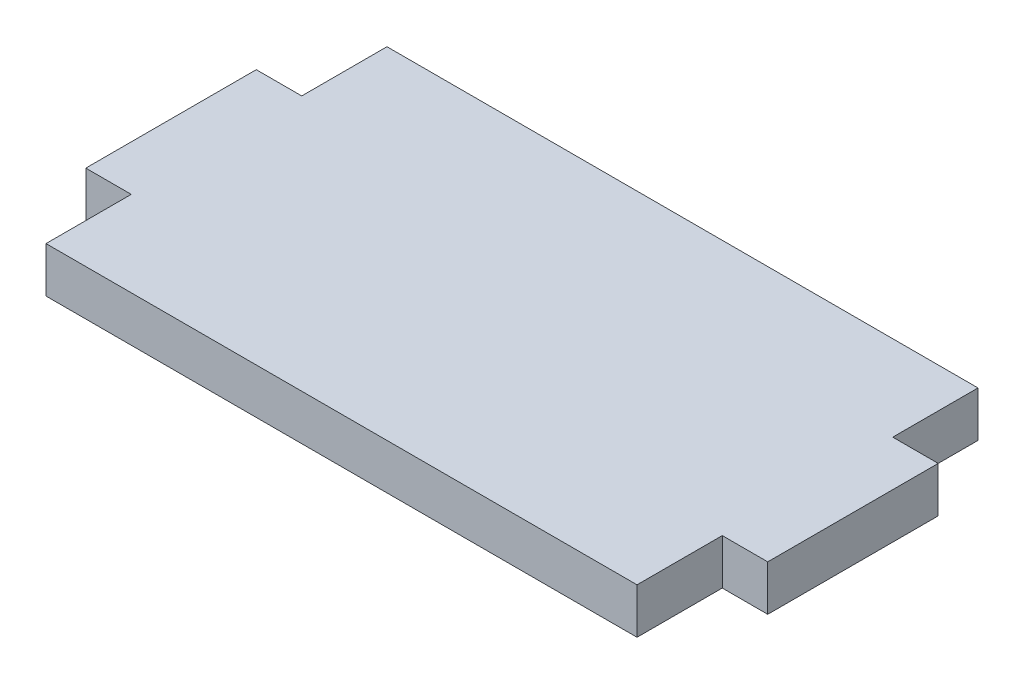
ISO-10303-21;
HEADER;
FILE_DESCRIPTION(('STEP AP214'),'2;1');
FILE_NAME('part.step','',(''),(''),'','','');
FILE_SCHEMA(('AUTOMOTIVE_DESIGN { 1 0 10303 214 1 1 1 1 }'));
ENDSEC;
DATA;
#1=APPLICATION_CONTEXT('core data for automotive mechanical design processes');
#2=APPLICATION_PROTOCOL_DEFINITION('international standard','automotive_design',2000,#1);
#3=PRODUCT_CONTEXT('',#1,'mechanical');
#4=PRODUCT('Part','Part','',(#3));
#5=PRODUCT_RELATED_PRODUCT_CATEGORY('part','',(#4));
#6=PRODUCT_DEFINITION_FORMATION('','',#4);
#7=PRODUCT_DEFINITION_CONTEXT('part definition',#1,'design');
#8=PRODUCT_DEFINITION('design','',#6,#7);
#9=PRODUCT_DEFINITION_SHAPE('','',#8);
#10=(LENGTH_UNIT() NAMED_UNIT(*) SI_UNIT(.MILLI.,.METRE.));
#11=(NAMED_UNIT(*) PLANE_ANGLE_UNIT() SI_UNIT($,.RADIAN.));
#12=(NAMED_UNIT(*) SI_UNIT($,.STERADIAN.) SOLID_ANGLE_UNIT());
#13=UNCERTAINTY_MEASURE_WITH_UNIT(LENGTH_MEASURE(1.E-05),#10,'distance_accuracy_value','');
#14=(GEOMETRIC_REPRESENTATION_CONTEXT(3) GLOBAL_UNCERTAINTY_ASSIGNED_CONTEXT((#13)) GLOBAL_UNIT_ASSIGNED_CONTEXT((#10,
#11,#12)) REPRESENTATION_CONTEXT('',''));
#15=CARTESIAN_POINT('',(0.,0.,0.));
#16=DIRECTION('',(0.,0.,1.));
#17=DIRECTION('',(1.,0.,0.));
#18=AXIS2_PLACEMENT_3D('',#15,#16,#17);
#19=CARTESIAN_POINT('',(-26.,4.,-7.5));
#20=DIRECTION('',(1.,0.,0.));
#21=DIRECTION('',(0.,0.,-1.));
#22=AXIS2_PLACEMENT_3D('',#19,#20,#21);
#23=PLANE('',#22);
#24=DIRECTION('',(0.,0.,1.));
#25=VECTOR('',#24,1.);
#26=CARTESIAN_POINT('',(-26.,0.,-7.5));
#27=LINE('',#26,#25);
#28=CARTESIAN_POINT('',(-26.,0.,-15.));
#29=VERTEX_POINT('',#28);
#30=CARTESIAN_POINT('',(-26.,0.,-7.5));
#31=VERTEX_POINT('',#30);
#32=EDGE_CURVE('E161',#29,#31,#27,.T.);
#33=ORIENTED_EDGE('',*,*,#32,.T.);
#34=DIRECTION('',(0.,-1.,0.));
#35=VECTOR('',#34,1.);
#36=CARTESIAN_POINT('',(-26.,4.,-7.5));
#37=LINE('',#36,#35);
#38=CARTESIAN_POINT('',(-26.,4.,-7.5));
#39=VERTEX_POINT('',#38);
#40=EDGE_CURVE('E11',#39,#31,#37,.T.);
#41=ORIENTED_EDGE('',*,*,#40,.F.);
#42=DIRECTION('',(0.,0.,1.));
#43=VECTOR('',#42,1.);
#44=CARTESIAN_POINT('',(-26.,4.,-7.5));
#45=LINE('',#44,#43);
#46=CARTESIAN_POINT('',(-26.,4.,-15.));
#47=VERTEX_POINT('',#46);
#48=EDGE_CURVE('E183',#47,#39,#45,.T.);
#49=ORIENTED_EDGE('',*,*,#48,.F.);
#50=DIRECTION('',(0.,-1.,0.));
#51=VECTOR('',#50,1.);
#52=CARTESIAN_POINT('',(-26.,4.,-15.));
#53=LINE('',#52,#51);
#54=EDGE_CURVE('E157',#47,#29,#53,.T.);
#55=ORIENTED_EDGE('',*,*,#54,.T.);
#56=EDGE_LOOP('',(#33,#41,#49,#55));
#57=FACE_BOUND('',#56,.T.);
#58=ADVANCED_FACE('F41',(#57),#23,.F.);
#59=CARTESIAN_POINT('',(-30.,4.,-7.5));
#60=DIRECTION('',(0.,0.,1.));
#61=DIRECTION('',(1.,0.,0.));
#62=AXIS2_PLACEMENT_3D('',#59,#60,#61);
#63=PLANE('',#62);
#64=DIRECTION('',(-1.,0.,0.));
#65=VECTOR('',#64,1.);
#66=CARTESIAN_POINT('',(-30.,0.,-7.5));
#67=LINE('',#66,#65);
#68=CARTESIAN_POINT('',(-30.,0.,-7.5));
#69=VERTEX_POINT('',#68);
#70=EDGE_CURVE('E164',#31,#69,#67,.T.);
#71=ORIENTED_EDGE('',*,*,#70,.T.);
#72=DIRECTION('',(0.,-1.,0.));
#73=VECTOR('',#72,1.);
#74=CARTESIAN_POINT('',(-30.,4.,-7.5));
#75=LINE('',#74,#73);
#76=CARTESIAN_POINT('',(-30.,4.,-7.5));
#77=VERTEX_POINT('',#76);
#78=EDGE_CURVE('E49',#77,#69,#75,.T.);
#79=ORIENTED_EDGE('',*,*,#78,.F.);
#80=DIRECTION('',(-1.,0.,0.));
#81=VECTOR('',#80,1.);
#82=CARTESIAN_POINT('',(-30.,4.,-7.5));
#83=LINE('',#82,#81);
#84=EDGE_CURVE('E112',#39,#77,#83,.T.);
#85=ORIENTED_EDGE('',*,*,#84,.F.);
#86=ORIENTED_EDGE('',*,*,#40,.T.);
#87=EDGE_LOOP('',(#71,#79,#85,#86));
#88=FACE_BOUND('',#87,.T.);
#89=ADVANCED_FACE('F261',(#88),#63,.F.);
#90=CARTESIAN_POINT('',(-30.,4.,7.5));
#91=DIRECTION('',(1.,0.,0.));
#92=DIRECTION('',(0.,0.,-1.));
#93=AXIS2_PLACEMENT_3D('',#90,#91,#92);
#94=PLANE('',#93);
#95=DIRECTION('',(0.,0.,1.));
#96=VECTOR('',#95,1.);
#97=CARTESIAN_POINT('',(-30.,0.,7.5));
#98=LINE('',#97,#96);
#99=CARTESIAN_POINT('',(-30.,0.,7.5));
#100=VERTEX_POINT('',#99);
#101=EDGE_CURVE('E166',#69,#100,#98,.T.);
#102=ORIENTED_EDGE('',*,*,#101,.T.);
#103=DIRECTION('',(0.,-1.,0.));
#104=VECTOR('',#103,1.);
#105=CARTESIAN_POINT('',(-30.,4.,7.5));
#106=LINE('',#105,#104);
#107=CARTESIAN_POINT('',(-30.,4.,7.5));
#108=VERTEX_POINT('',#107);
#109=EDGE_CURVE('E202',#108,#100,#106,.T.);
#110=ORIENTED_EDGE('',*,*,#109,.F.);
#111=DIRECTION('',(0.,0.,1.));
#112=VECTOR('',#111,1.);
#113=CARTESIAN_POINT('',(-30.,4.,7.5));
#114=LINE('',#113,#112);
#115=EDGE_CURVE('E210',#77,#108,#114,.T.);
#116=ORIENTED_EDGE('',*,*,#115,.F.);
#117=ORIENTED_EDGE('',*,*,#78,.T.);
#118=EDGE_LOOP('',(#102,#110,#116,#117));
#119=FACE_BOUND('',#118,.T.);
#120=ADVANCED_FACE('F208',(#119),#94,.F.);
#121=CARTESIAN_POINT('',(-30.,4.,7.5));
#122=DIRECTION('',(0.,0.,-1.));
#123=DIRECTION('',(-1.,0.,0.));
#124=AXIS2_PLACEMENT_3D('',#121,#122,#123);
#125=PLANE('',#124);
#126=DIRECTION('',(1.,0.,0.));
#127=VECTOR('',#126,1.);
#128=CARTESIAN_POINT('',(-30.,0.,7.5));
#129=LINE('',#128,#127);
#130=CARTESIAN_POINT('',(-26.,0.,7.5));
#131=VERTEX_POINT('',#130);
#132=EDGE_CURVE('E168',#100,#131,#129,.T.);
#133=ORIENTED_EDGE('',*,*,#132,.T.);
#134=DIRECTION('',(0.,-1.,0.));
#135=VECTOR('',#134,1.);
#136=CARTESIAN_POINT('',(-26.,4.,7.5));
#137=LINE('',#136,#135);
#138=CARTESIAN_POINT('',(-26.,4.,7.5));
#139=VERTEX_POINT('',#138);
#140=EDGE_CURVE('E199',#139,#131,#137,.T.);
#141=ORIENTED_EDGE('',*,*,#140,.F.);
#142=DIRECTION('',(1.,0.,0.));
#143=VECTOR('',#142,1.);
#144=CARTESIAN_POINT('',(-30.,4.,7.5));
#145=LINE('',#144,#143);
#146=EDGE_CURVE('E228',#108,#139,#145,.T.);
#147=ORIENTED_EDGE('',*,*,#146,.F.);
#148=ORIENTED_EDGE('',*,*,#109,.T.);
#149=EDGE_LOOP('',(#133,#141,#147,#148));
#150=FACE_BOUND('',#149,.T.);
#151=ADVANCED_FACE('F219',(#150),#125,.F.);
#152=CARTESIAN_POINT('',(-26.,4.,15.));
#153=DIRECTION('',(1.,0.,0.));
#154=DIRECTION('',(0.,0.,-1.));
#155=AXIS2_PLACEMENT_3D('',#152,#153,#154);
#156=PLANE('',#155);
#157=DIRECTION('',(0.,0.,1.));
#158=VECTOR('',#157,1.);
#159=CARTESIAN_POINT('',(-26.,0.,15.));
#160=LINE('',#159,#158);
#161=CARTESIAN_POINT('',(-26.,0.,15.));
#162=VERTEX_POINT('',#161);
#163=EDGE_CURVE('E170',#131,#162,#160,.T.);
#164=ORIENTED_EDGE('',*,*,#163,.T.);
#165=DIRECTION('',(0.,-1.,0.));
#166=VECTOR('',#165,1.);
#167=CARTESIAN_POINT('',(-26.,4.,15.));
#168=LINE('',#167,#166);
#169=CARTESIAN_POINT('',(-26.,4.,15.));
#170=VERTEX_POINT('',#169);
#171=EDGE_CURVE('E196',#170,#162,#168,.T.);
#172=ORIENTED_EDGE('',*,*,#171,.F.);
#173=DIRECTION('',(0.,0.,1.));
#174=VECTOR('',#173,1.);
#175=CARTESIAN_POINT('',(-26.,4.,15.));
#176=LINE('',#175,#174);
#177=EDGE_CURVE('E225',#139,#170,#176,.T.);
#178=ORIENTED_EDGE('',*,*,#177,.F.);
#179=ORIENTED_EDGE('',*,*,#140,.T.);
#180=EDGE_LOOP('',(#164,#172,#178,#179));
#181=FACE_BOUND('',#180,.T.);
#182=ADVANCED_FACE('F223',(#181),#156,.F.);
#183=CARTESIAN_POINT('',(26.,4.,15.));
#184=DIRECTION('',(0.,0.,-1.));
#185=DIRECTION('',(-1.,0.,0.));
#186=AXIS2_PLACEMENT_3D('',#183,#184,#185);
#187=PLANE('',#186);
#188=DIRECTION('',(1.,0.,0.));
#189=VECTOR('',#188,1.);
#190=CARTESIAN_POINT('',(26.,0.,15.));
#191=LINE('',#190,#189);
#192=CARTESIAN_POINT('',(26.,0.,15.));
#193=VERTEX_POINT('',#192);
#194=EDGE_CURVE('E172',#162,#193,#191,.T.);
#195=ORIENTED_EDGE('',*,*,#194,.T.);
#196=DIRECTION('',(0.,-1.,0.));
#197=VECTOR('',#196,1.);
#198=CARTESIAN_POINT('',(26.,4.,15.));
#199=LINE('',#198,#197);
#200=CARTESIAN_POINT('',(26.,4.,15.));
#201=VERTEX_POINT('',#200);
#202=EDGE_CURVE('E193',#201,#193,#199,.T.);
#203=ORIENTED_EDGE('',*,*,#202,.F.);
#204=DIRECTION('',(1.,0.,0.));
#205=VECTOR('',#204,1.);
#206=CARTESIAN_POINT('',(26.,4.,15.));
#207=LINE('',#206,#205);
#208=EDGE_CURVE('E227',#170,#201,#207,.T.);
#209=ORIENTED_EDGE('',*,*,#208,.F.);
#210=ORIENTED_EDGE('',*,*,#171,.T.);
#211=EDGE_LOOP('',(#195,#203,#209,#210));
#212=FACE_BOUND('',#211,.T.);
#213=ADVANCED_FACE('F274',(#212),#187,.F.);
#214=CARTESIAN_POINT('',(26.,4.,15.));
#215=DIRECTION('',(-1.,0.,0.));
#216=DIRECTION('',(0.,0.,1.));
#217=AXIS2_PLACEMENT_3D('',#214,#215,#216);
#218=PLANE('',#217);
#219=DIRECTION('',(0.,0.,-1.));
#220=VECTOR('',#219,1.);
#221=CARTESIAN_POINT('',(26.,0.,15.));
#222=LINE('',#221,#220);
#223=CARTESIAN_POINT('',(26.,0.,7.5));
#224=VERTEX_POINT('',#223);
#225=EDGE_CURVE('E174',#193,#224,#222,.T.);
#226=ORIENTED_EDGE('',*,*,#225,.T.);
#227=DIRECTION('',(0.,-1.,0.));
#228=VECTOR('',#227,1.);
#229=CARTESIAN_POINT('',(26.,4.,7.5));
#230=LINE('',#229,#228);
#231=CARTESIAN_POINT('',(26.,4.,7.5));
#232=VERTEX_POINT('',#231);
#233=EDGE_CURVE('E190',#232,#224,#230,.T.);
#234=ORIENTED_EDGE('',*,*,#233,.F.);
#235=DIRECTION('',(0.,0.,-1.));
#236=VECTOR('',#235,1.);
#237=CARTESIAN_POINT('',(26.,4.,15.));
#238=LINE('',#237,#236);
#239=EDGE_CURVE('E230',#201,#232,#238,.T.);
#240=ORIENTED_EDGE('',*,*,#239,.F.);
#241=ORIENTED_EDGE('',*,*,#202,.T.);
#242=EDGE_LOOP('',(#226,#234,#240,#241));
#243=FACE_BOUND('',#242,.T.);
#244=ADVANCED_FACE('F277',(#243),#218,.F.);
#245=CARTESIAN_POINT('',(30.,4.,7.5));
#246=DIRECTION('',(0.,0.,-1.));
#247=DIRECTION('',(-1.,0.,0.));
#248=AXIS2_PLACEMENT_3D('',#245,#246,#247);
#249=PLANE('',#248);
#250=DIRECTION('',(1.,0.,0.));
#251=VECTOR('',#250,1.);
#252=CARTESIAN_POINT('',(30.,0.,7.5));
#253=LINE('',#252,#251);
#254=CARTESIAN_POINT('',(30.,0.,7.5));
#255=VERTEX_POINT('',#254);
#256=EDGE_CURVE('E176',#224,#255,#253,.T.);
#257=ORIENTED_EDGE('',*,*,#256,.T.);
#258=DIRECTION('',(0.,-1.,0.));
#259=VECTOR('',#258,1.);
#260=CARTESIAN_POINT('',(30.,4.,7.5));
#261=LINE('',#260,#259);
#262=CARTESIAN_POINT('',(30.,4.,7.5));
#263=VERTEX_POINT('',#262);
#264=EDGE_CURVE('E187',#263,#255,#261,.T.);
#265=ORIENTED_EDGE('',*,*,#264,.F.);
#266=DIRECTION('',(1.,0.,0.));
#267=VECTOR('',#266,1.);
#268=CARTESIAN_POINT('',(30.,4.,7.5));
#269=LINE('',#268,#267);
#270=EDGE_CURVE('E236',#232,#263,#269,.T.);
#271=ORIENTED_EDGE('',*,*,#270,.F.);
#272=ORIENTED_EDGE('',*,*,#233,.T.);
#273=EDGE_LOOP('',(#257,#265,#271,#272));
#274=FACE_BOUND('',#273,.T.);
#275=ADVANCED_FACE('F242',(#274),#249,.F.);
#276=CARTESIAN_POINT('',(30.,4.,7.5));
#277=DIRECTION('',(-1.,0.,0.));
#278=DIRECTION('',(0.,0.,1.));
#279=AXIS2_PLACEMENT_3D('',#276,#277,#278);
#280=PLANE('',#279);
#281=DIRECTION('',(0.,0.,-1.));
#282=VECTOR('',#281,1.);
#283=CARTESIAN_POINT('',(30.,0.,7.5));
#284=LINE('',#283,#282);
#285=CARTESIAN_POINT('',(30.,0.,-7.5));
#286=VERTEX_POINT('',#285);
#287=EDGE_CURVE('E178',#255,#286,#284,.T.);
#288=ORIENTED_EDGE('',*,*,#287,.T.);
#289=DIRECTION('',(0.,-1.,0.));
#290=VECTOR('',#289,1.);
#291=CARTESIAN_POINT('',(30.,4.,-7.5));
#292=LINE('',#291,#290);
#293=CARTESIAN_POINT('',(30.,4.,-7.5));
#294=VERTEX_POINT('',#293);
#295=EDGE_CURVE('E152',#294,#286,#292,.T.);
#296=ORIENTED_EDGE('',*,*,#295,.F.);
#297=DIRECTION('',(0.,0.,-1.));
#298=VECTOR('',#297,1.);
#299=CARTESIAN_POINT('',(30.,4.,7.5));
#300=LINE('',#299,#298);
#301=EDGE_CURVE('E143',#263,#294,#300,.T.);
#302=ORIENTED_EDGE('',*,*,#301,.F.);
#303=ORIENTED_EDGE('',*,*,#264,.T.);
#304=EDGE_LOOP('',(#288,#296,#302,#303));
#305=FACE_BOUND('',#304,.T.);
#306=ADVANCED_FACE('F246',(#305),#280,.F.);
#307=CARTESIAN_POINT('',(30.,4.,-7.5));
#308=DIRECTION('',(0.,0.,1.));
#309=DIRECTION('',(1.,0.,0.));
#310=AXIS2_PLACEMENT_3D('',#307,#308,#309);
#311=PLANE('',#310);
#312=DIRECTION('',(-1.,0.,0.));
#313=VECTOR('',#312,1.);
#314=CARTESIAN_POINT('',(30.,0.,-7.5));
#315=LINE('',#314,#313);
#316=CARTESIAN_POINT('',(26.,0.,-7.5));
#317=VERTEX_POINT('',#316);
#318=EDGE_CURVE('E151',#286,#317,#315,.T.);
#319=ORIENTED_EDGE('',*,*,#318,.T.);
#320=DIRECTION('',(0.,-1.,0.));
#321=VECTOR('',#320,1.);
#322=CARTESIAN_POINT('',(26.,4.,-7.5));
#323=LINE('',#322,#321);
#324=CARTESIAN_POINT('',(26.,4.,-7.5));
#325=VERTEX_POINT('',#324);
#326=EDGE_CURVE('E148',#325,#317,#323,.T.);
#327=ORIENTED_EDGE('',*,*,#326,.F.);
#328=DIRECTION('',(-1.,0.,0.));
#329=VECTOR('',#328,1.);
#330=CARTESIAN_POINT('',(30.,4.,-7.5));
#331=LINE('',#330,#329);
#332=EDGE_CURVE('E137',#294,#325,#331,.T.);
#333=ORIENTED_EDGE('',*,*,#332,.F.);
#334=ORIENTED_EDGE('',*,*,#295,.T.);
#335=EDGE_LOOP('',(#319,#327,#333,#334));
#336=FACE_BOUND('',#335,.T.);
#337=ADVANCED_FACE('F149',(#336),#311,.F.);
#338=CARTESIAN_POINT('',(26.,4.,-7.5));
#339=DIRECTION('',(-1.,0.,0.));
#340=DIRECTION('',(0.,0.,1.));
#341=AXIS2_PLACEMENT_3D('',#338,#339,#340);
#342=PLANE('',#341);
#343=DIRECTION('',(0.,0.,-1.));
#344=VECTOR('',#343,1.);
#345=CARTESIAN_POINT('',(26.,0.,-7.5));
#346=LINE('',#345,#344);
#347=CARTESIAN_POINT('',(26.,0.,-15.));
#348=VERTEX_POINT('',#347);
#349=EDGE_CURVE('E98',#317,#348,#346,.T.);
#350=ORIENTED_EDGE('',*,*,#349,.T.);
#351=DIRECTION('',(0.,-1.,0.));
#352=VECTOR('',#351,1.);
#353=CARTESIAN_POINT('',(26.,4.,-15.));
#354=LINE('',#353,#352);
#355=CARTESIAN_POINT('',(26.,4.,-15.));
#356=VERTEX_POINT('',#355);
#357=EDGE_CURVE('E153',#356,#348,#354,.T.);
#358=ORIENTED_EDGE('',*,*,#357,.F.);
#359=DIRECTION('',(0.,0.,-1.));
#360=VECTOR('',#359,1.);
#361=CARTESIAN_POINT('',(26.,4.,-7.5));
#362=LINE('',#361,#360);
#363=EDGE_CURVE('E141',#325,#356,#362,.T.);
#364=ORIENTED_EDGE('',*,*,#363,.F.);
#365=ORIENTED_EDGE('',*,*,#326,.T.);
#366=EDGE_LOOP('',(#350,#358,#364,#365));
#367=FACE_BOUND('',#366,.T.);
#368=ADVANCED_FACE('F155',(#367),#342,.F.);
#369=CARTESIAN_POINT('',(26.,4.,-15.));
#370=DIRECTION('',(0.,0.,1.));
#371=DIRECTION('',(1.,0.,0.));
#372=AXIS2_PLACEMENT_3D('',#369,#370,#371);
#373=PLANE('',#372);
#374=DIRECTION('',(-1.,0.,0.));
#375=VECTOR('',#374,1.);
#376=CARTESIAN_POINT('',(26.,0.,-15.));
#377=LINE('',#376,#375);
#378=EDGE_CURVE('E104',#348,#29,#377,.T.);
#379=ORIENTED_EDGE('',*,*,#378,.T.);
#380=ORIENTED_EDGE('',*,*,#54,.F.);
#381=DIRECTION('',(-1.,0.,0.));
#382=VECTOR('',#381,1.);
#383=CARTESIAN_POINT('',(26.,4.,-15.));
#384=LINE('',#383,#382);
#385=EDGE_CURVE('E57',#356,#47,#384,.T.);
#386=ORIENTED_EDGE('',*,*,#385,.F.);
#387=ORIENTED_EDGE('',*,*,#357,.T.);
#388=EDGE_LOOP('',(#379,#380,#386,#387));
#389=FACE_BOUND('',#388,.T.);
#390=ADVANCED_FACE('F250',(#389),#373,.F.);
#391=CARTESIAN_POINT('',(0.,4.,0.));
#392=DIRECTION('',(0.,1.,0.));
#393=DIRECTION('',(0.,0.,1.));
#394=AXIS2_PLACEMENT_3D('',#391,#392,#393);
#395=PLANE('',#394);
#396=ORIENTED_EDGE('',*,*,#48,.T.);
#397=ORIENTED_EDGE('',*,*,#84,.T.);
#398=ORIENTED_EDGE('',*,*,#115,.T.);
#399=ORIENTED_EDGE('',*,*,#146,.T.);
#400=ORIENTED_EDGE('',*,*,#177,.T.);
#401=ORIENTED_EDGE('',*,*,#208,.T.);
#402=ORIENTED_EDGE('',*,*,#239,.T.);
#403=ORIENTED_EDGE('',*,*,#270,.T.);
#404=ORIENTED_EDGE('',*,*,#301,.T.);
#405=ORIENTED_EDGE('',*,*,#332,.T.);
#406=ORIENTED_EDGE('',*,*,#363,.T.);
#407=ORIENTED_EDGE('',*,*,#385,.T.);
#408=EDGE_LOOP('',(#396,#397,#398,#399,#400,#401,#402,#403,#404,#405,#406,#407));
#409=FACE_BOUND('',#408,.T.);
#410=ADVANCED_FACE('F139',(#409),#395,.T.);
#411=CARTESIAN_POINT('',(0.,0.,0.));
#412=DIRECTION('',(0.,1.,0.));
#413=DIRECTION('',(0.,0.,1.));
#414=AXIS2_PLACEMENT_3D('',#411,#412,#413);
#415=PLANE('',#414);
#416=ORIENTED_EDGE('',*,*,#32,.F.);
#417=ORIENTED_EDGE('',*,*,#378,.F.);
#418=ORIENTED_EDGE('',*,*,#349,.F.);
#419=ORIENTED_EDGE('',*,*,#318,.F.);
#420=ORIENTED_EDGE('',*,*,#287,.F.);
#421=ORIENTED_EDGE('',*,*,#256,.F.);
#422=ORIENTED_EDGE('',*,*,#225,.F.);
#423=ORIENTED_EDGE('',*,*,#194,.F.);
#424=ORIENTED_EDGE('',*,*,#163,.F.);
#425=ORIENTED_EDGE('',*,*,#132,.F.);
#426=ORIENTED_EDGE('',*,*,#101,.F.);
#427=ORIENTED_EDGE('',*,*,#70,.F.);
#428=EDGE_LOOP('',(#416,#417,#418,#419,#420,#421,#422,#423,#424,#425,#426,#427));
#429=FACE_BOUND('',#428,.T.);
#430=ADVANCED_FACE('F214',(#429),#415,.F.);
#431=CLOSED_SHELL('',(#58,#89,#120,#151,#182,#213,#244,#275,#306,#337,#368,#390,#410,#430));
#432=MANIFOLD_SOLID_BREP('B2',#431);
#433=ADVANCED_BREP_SHAPE_REPRESENTATION('',(#18,#432),#14);
#434=SHAPE_DEFINITION_REPRESENTATION(#9,#433);
ENDSEC;
END-ISO-10303-21;
